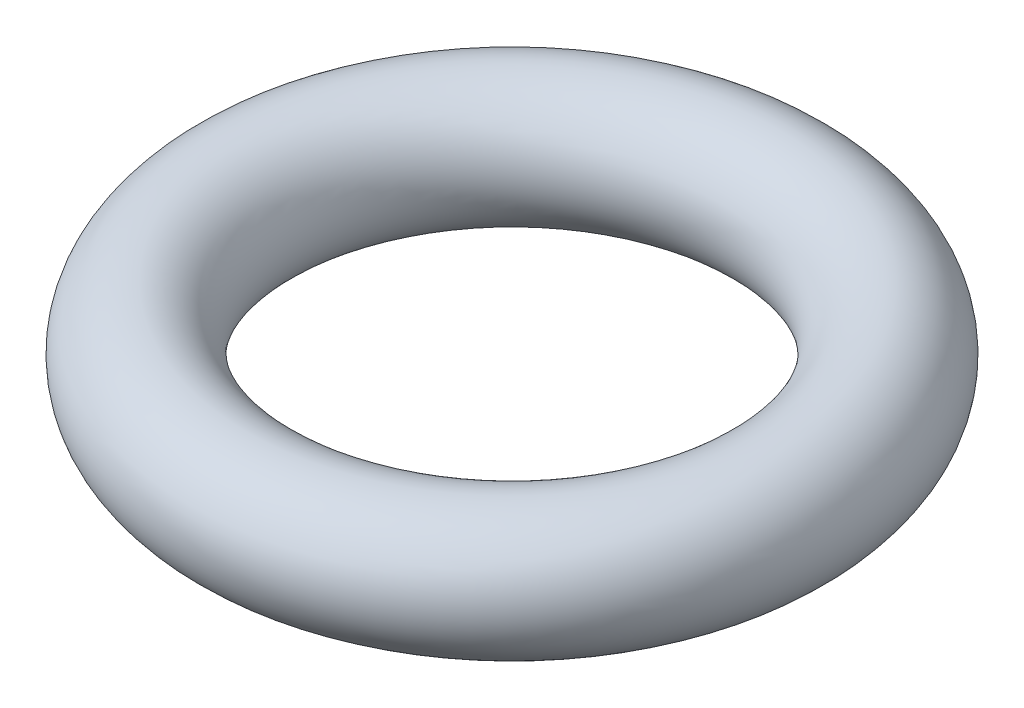
ISO-10303-21;
HEADER;
FILE_DESCRIPTION(('STEP AP214'),'2;1');
FILE_NAME('part.step','',(''),(''),'','','');
FILE_SCHEMA(('AUTOMOTIVE_DESIGN { 1 0 10303 214 1 1 1 1 }'));
ENDSEC;
DATA;
#1=APPLICATION_CONTEXT('core data for automotive mechanical design processes');
#2=APPLICATION_PROTOCOL_DEFINITION('international standard','automotive_design',2000,#1);
#3=PRODUCT_CONTEXT('',#1,'mechanical');
#4=PRODUCT('Part','Part','',(#3));
#5=PRODUCT_RELATED_PRODUCT_CATEGORY('part','',(#4));
#6=PRODUCT_DEFINITION_FORMATION('','',#4);
#7=PRODUCT_DEFINITION_CONTEXT('part definition',#1,'design');
#8=PRODUCT_DEFINITION('design','',#6,#7);
#9=PRODUCT_DEFINITION_SHAPE('','',#8);
#10=(LENGTH_UNIT() NAMED_UNIT(*) SI_UNIT(.MILLI.,.METRE.));
#11=(NAMED_UNIT(*) PLANE_ANGLE_UNIT() SI_UNIT($,.RADIAN.));
#12=(NAMED_UNIT(*) SI_UNIT($,.STERADIAN.) SOLID_ANGLE_UNIT());
#13=UNCERTAINTY_MEASURE_WITH_UNIT(LENGTH_MEASURE(1.E-05),#10,'distance_accuracy_value','');
#14=(GEOMETRIC_REPRESENTATION_CONTEXT(3) GLOBAL_UNCERTAINTY_ASSIGNED_CONTEXT((#13)) GLOBAL_UNIT_ASSIGNED_CONTEXT((#10,
#11,#12)) REPRESENTATION_CONTEXT('',''));
#15=CARTESIAN_POINT('',(0.,0.,0.));
#16=DIRECTION('',(0.,0.,1.));
#17=DIRECTION('',(1.,0.,0.));
#18=AXIS2_PLACEMENT_3D('',#15,#16,#17);
#19=CARTESIAN_POINT('',(0.,0.,0.));
#20=DIRECTION('',(0.,-1.,0.));
#21=DIRECTION('',(0.,0.,-1.));
#22=AXIS2_PLACEMENT_3D('',#19,#20,#21);
#23=TOROIDAL_SURFACE('',#22,2.0878,0.5);
#24=CARTESIAN_POINT('',(0.,0.,-2.5878));
#25=VERTEX_POINT('',#24);
#26=VERTEX_LOOP('',#25);
#27=FACE_BOUND('',#26,.T.);
#28=ADVANCED_FACE('F35',(#27),#23,.T.);
#29=CLOSED_SHELL('',(#28));
#30=MANIFOLD_SOLID_BREP('B2',#29);
#31=ADVANCED_BREP_SHAPE_REPRESENTATION('',(#18,#30),#14);
#32=SHAPE_DEFINITION_REPRESENTATION(#9,#31);
ENDSEC;
END-ISO-10303-21;
